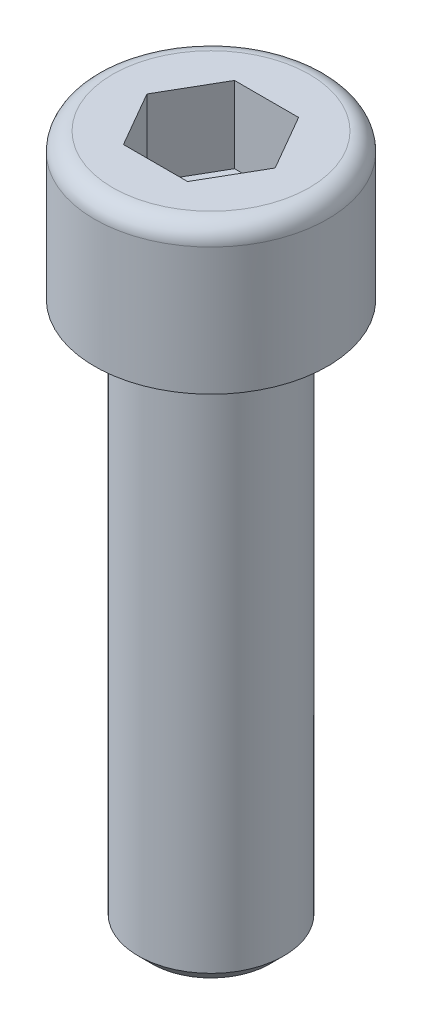
ISO-10303-21;
HEADER;
FILE_DESCRIPTION(('STEP AP214'),'2;1');
FILE_NAME('part.step','',(''),(''),'','','');
FILE_SCHEMA(('AUTOMOTIVE_DESIGN { 1 0 10303 214 1 1 1 1 }'));
ENDSEC;
DATA;
#1=APPLICATION_CONTEXT('core data for automotive mechanical design processes');
#2=APPLICATION_PROTOCOL_DEFINITION('international standard','automotive_design',2000,#1);
#3=PRODUCT_CONTEXT('',#1,'mechanical');
#4=PRODUCT('Part','Part','',(#3));
#5=PRODUCT_RELATED_PRODUCT_CATEGORY('part','',(#4));
#6=PRODUCT_DEFINITION_FORMATION('','',#4);
#7=PRODUCT_DEFINITION_CONTEXT('part definition',#1,'design');
#8=PRODUCT_DEFINITION('design','',#6,#7);
#9=PRODUCT_DEFINITION_SHAPE('','',#8);
#10=(LENGTH_UNIT() NAMED_UNIT(*) SI_UNIT(.MILLI.,.METRE.));
#11=(NAMED_UNIT(*) PLANE_ANGLE_UNIT() SI_UNIT($,.RADIAN.));
#12=(NAMED_UNIT(*) SI_UNIT($,.STERADIAN.) SOLID_ANGLE_UNIT());
#13=UNCERTAINTY_MEASURE_WITH_UNIT(LENGTH_MEASURE(1.E-05),#10,'distance_accuracy_value','');
#14=(GEOMETRIC_REPRESENTATION_CONTEXT(3) GLOBAL_UNCERTAINTY_ASSIGNED_CONTEXT((#13)) GLOBAL_UNIT_ASSIGNED_CONTEXT((#10,
#11,#12)) REPRESENTATION_CONTEXT('',''));
#15=CARTESIAN_POINT('',(0.,0.,0.));
#16=DIRECTION('',(0.,0.,1.));
#17=DIRECTION('',(1.,0.,0.));
#18=AXIS2_PLACEMENT_3D('',#15,#16,#17);
#19=CARTESIAN_POINT('',(0.,0.,0.));
#20=DIRECTION('',(0.,-1.,0.));
#21=DIRECTION('',(0.,0.,-1.));
#22=AXIS2_PLACEMENT_3D('',#19,#20,#21);
#23=PLANE('',#22);
#24=CARTESIAN_POINT('',(0.,0.,0.));
#25=DIRECTION('',(0.,-1.,0.));
#26=DIRECTION('',(0.,0.,-1.));
#27=AXIS2_PLACEMENT_3D('',#24,#25,#26);
#28=CIRCLE('',#27,6.4);
#29=CARTESIAN_POINT('',(0.,0.,-6.4));
#30=VERTEX_POINT('',#29);
#31=EDGE_CURVE('E142',#30,#30,#28,.T.);
#32=ORIENTED_EDGE('',*,*,#31,.T.);
#33=EDGE_LOOP('',(#32));
#34=FACE_BOUND('',#33,.T.);
#35=CARTESIAN_POINT('',(0.,0.,0.));
#36=DIRECTION('',(0.,-1.,0.));
#37=DIRECTION('',(0.,0.,-1.));
#38=AXIS2_PLACEMENT_3D('',#35,#36,#37);
#39=CIRCLE('',#38,4.);
#40=CARTESIAN_POINT('',(0.,0.,-4.));
#41=VERTEX_POINT('',#40);
#42=EDGE_CURVE('E134',#41,#41,#39,.T.);
#43=ORIENTED_EDGE('',*,*,#42,.F.);
#44=EDGE_LOOP('',(#43));
#45=FACE_BOUND('',#44,.T.);
#46=ADVANCED_FACE('F32',(#34,#45),#23,.T.);
#47=CARTESIAN_POINT('',(0.,8.,0.));
#48=DIRECTION('',(0.,-1.,0.));
#49=DIRECTION('',(0.,0.,-1.));
#50=AXIS2_PLACEMENT_3D('',#47,#48,#49);
#51=CYLINDRICAL_SURFACE('',#50,6.4);
#52=CARTESIAN_POINT('',(0.,7.,0.));
#53=DIRECTION('',(0.,1.,0.));
#54=DIRECTION('',(0.,0.,1.));
#55=AXIS2_PLACEMENT_3D('',#52,#53,#54);
#56=CIRCLE('',#55,6.4);
#57=CARTESIAN_POINT('',(0.,7.,6.4));
#58=VERTEX_POINT('',#57);
#59=EDGE_CURVE('E40',#58,#58,#56,.F.);
#60=ORIENTED_EDGE('',*,*,#59,.T.);
#61=EDGE_LOOP('',(#60));
#62=FACE_BOUND('',#61,.T.);
#63=ORIENTED_EDGE('',*,*,#31,.F.);
#64=EDGE_LOOP('',(#63));
#65=FACE_BOUND('',#64,.T.);
#66=ADVANCED_FACE('F153',(#62,#65),#51,.T.);
#67=CARTESIAN_POINT('',(6.4,8.,0.));
#68=DIRECTION('',(0.,1.,0.));
#69=DIRECTION('',(0.,0.,1.));
#70=AXIS2_PLACEMENT_3D('',#67,#68,#69);
#71=PLANE('',#70);
#72=CARTESIAN_POINT('',(0.,8.,0.));
#73=DIRECTION('',(0.,1.,0.));
#74=DIRECTION('',(0.,0.,1.));
#75=AXIS2_PLACEMENT_3D('',#72,#73,#74);
#76=CIRCLE('',#75,5.4);
#77=CARTESIAN_POINT('',(0.,8.,5.4));
#78=VERTEX_POINT('',#77);
#79=EDGE_CURVE('E11',#78,#78,#76,.T.);
#80=ORIENTED_EDGE('',*,*,#79,.T.);
#81=EDGE_LOOP('',(#80));
#82=FACE_BOUND('',#81,.T.);
#83=DIRECTION('',(0.5,0.,0.866025403784438));
#84=VECTOR('',#83,1.);
#85=CARTESIAN_POINT('',(-3.52183664205672,8.,0.));
#86=LINE('',#85,#84);
#87=CARTESIAN_POINT('',(-3.52183664205672,8.,0.));
#88=VERTEX_POINT('',#87);
#89=CARTESIAN_POINT('',(-1.76091832102836,8.,3.05));
#90=VERTEX_POINT('',#89);
#91=EDGE_CURVE('E47',#88,#90,#86,.T.);
#92=ORIENTED_EDGE('',*,*,#91,.F.);
#93=DIRECTION('',(-0.5,0.,0.866025403784438));
#94=VECTOR('',#93,1.);
#95=CARTESIAN_POINT('',(-1.76091832102836,8.,-3.05));
#96=LINE('',#95,#94);
#97=CARTESIAN_POINT('',(-1.76091832102836,8.,-3.05));
#98=VERTEX_POINT('',#97);
#99=EDGE_CURVE('E130',#98,#88,#96,.T.);
#100=ORIENTED_EDGE('',*,*,#99,.F.);
#101=DIRECTION('',(-1.,0.,0.));
#102=VECTOR('',#101,1.);
#103=CARTESIAN_POINT('',(1.76091832102836,8.,-3.05));
#104=LINE('',#103,#102);
#105=CARTESIAN_POINT('',(1.76091832102836,8.,-3.05));
#106=VERTEX_POINT('',#105);
#107=EDGE_CURVE('E128',#106,#98,#104,.T.);
#108=ORIENTED_EDGE('',*,*,#107,.F.);
#109=DIRECTION('',(-0.499999999999999,0.,-0.866025403784439));
#110=VECTOR('',#109,1.);
#111=CARTESIAN_POINT('',(3.52183664205671,8.,0.));
#112=LINE('',#111,#110);
#113=CARTESIAN_POINT('',(3.52183664205671,8.,0.));
#114=VERTEX_POINT('',#113);
#115=EDGE_CURVE('E95',#114,#106,#112,.T.);
#116=ORIENTED_EDGE('',*,*,#115,.F.);
#117=DIRECTION('',(0.499999999999999,0.,-0.866025403784439));
#118=VECTOR('',#117,1.);
#119=CARTESIAN_POINT('',(1.76091832102836,8.,3.05));
#120=LINE('',#119,#118);
#121=CARTESIAN_POINT('',(1.76091832102836,8.,3.05));
#122=VERTEX_POINT('',#121);
#123=EDGE_CURVE('E124',#122,#114,#120,.T.);
#124=ORIENTED_EDGE('',*,*,#123,.F.);
#125=DIRECTION('',(1.,0.,0.));
#126=VECTOR('',#125,1.);
#127=CARTESIAN_POINT('',(-1.76091832102836,8.,3.05));
#128=LINE('',#127,#126);
#129=EDGE_CURVE('E121',#90,#122,#128,.T.);
#130=ORIENTED_EDGE('',*,*,#129,.F.);
#131=EDGE_LOOP('',(#92,#100,#108,#116,#124,#130));
#132=FACE_BOUND('',#131,.T.);
#133=ADVANCED_FACE('F170',(#82,#132),#71,.T.);
#134=CARTESIAN_POINT('',(0.,-30.,0.));
#135=DIRECTION('',(0.,1.,0.));
#136=DIRECTION('',(0.,0.,1.));
#137=AXIS2_PLACEMENT_3D('',#134,#135,#136);
#138=CYLINDRICAL_SURFACE('',#137,4.);
#139=CARTESIAN_POINT('',(0.,-29.25,0.));
#140=DIRECTION('',(0.,-1.,0.));
#141=DIRECTION('',(0.,0.,-1.));
#142=AXIS2_PLACEMENT_3D('',#139,#140,#141);
#143=CIRCLE('',#142,4.);
#144=CARTESIAN_POINT('',(0.,-29.25,-4.));
#145=VERTEX_POINT('',#144);
#146=EDGE_CURVE('E148',#145,#145,#143,.F.);
#147=ORIENTED_EDGE('',*,*,#146,.T.);
#148=EDGE_LOOP('',(#147));
#149=FACE_BOUND('',#148,.T.);
#150=ORIENTED_EDGE('',*,*,#42,.T.);
#151=EDGE_LOOP('',(#150));
#152=FACE_BOUND('',#151,.T.);
#153=ADVANCED_FACE('F175',(#149,#152),#138,.T.);
#154=CARTESIAN_POINT('',(0.,-30.,0.));
#155=DIRECTION('',(0.,-1.,0.));
#156=DIRECTION('',(0.,0.,-1.));
#157=AXIS2_PLACEMENT_3D('',#154,#155,#156);
#158=PLANE('',#157);
#159=CARTESIAN_POINT('',(0.,-30.,0.));
#160=DIRECTION('',(0.,-1.,0.));
#161=DIRECTION('',(0.,0.,-1.));
#162=AXIS2_PLACEMENT_3D('',#159,#160,#161);
#163=CIRCLE('',#162,3.25000000000001);
#164=CARTESIAN_POINT('',(0.,-30.,-3.25000000000001));
#165=VERTEX_POINT('',#164);
#166=EDGE_CURVE('E145',#165,#165,#163,.T.);
#167=ORIENTED_EDGE('',*,*,#166,.T.);
#168=EDGE_LOOP('',(#167));
#169=FACE_BOUND('',#168,.T.);
#170=ADVANCED_FACE('F182',(#169),#158,.T.);
#171=CARTESIAN_POINT('',(-3.52183664205672,3.8,0.));
#172=DIRECTION('',(-0.866025403784438,0.,0.5));
#173=DIRECTION('',(0.5,0.,0.866025403784439));
#174=AXIS2_PLACEMENT_3D('',#171,#172,#173);
#175=PLANE('',#174);
#176=ORIENTED_EDGE('',*,*,#91,.T.);
#177=DIRECTION('',(0.,1.,0.));
#178=VECTOR('',#177,1.);
#179=CARTESIAN_POINT('',(-1.76091832102836,3.8,3.05));
#180=LINE('',#179,#178);
#181=CARTESIAN_POINT('',(-1.76091832102836,3.8,3.05));
#182=VERTEX_POINT('',#181);
#183=EDGE_CURVE('E77',#182,#90,#180,.T.);
#184=ORIENTED_EDGE('',*,*,#183,.F.);
#185=DIRECTION('',(0.5,0.,0.866025403784438));
#186=VECTOR('',#185,1.);
#187=CARTESIAN_POINT('',(-3.52183664205672,3.8,0.));
#188=LINE('',#187,#186);
#189=CARTESIAN_POINT('',(-3.52183664205672,3.8,0.));
#190=VERTEX_POINT('',#189);
#191=EDGE_CURVE('E132',#190,#182,#188,.T.);
#192=ORIENTED_EDGE('',*,*,#191,.F.);
#193=DIRECTION('',(0.,1.,0.));
#194=VECTOR('',#193,1.);
#195=CARTESIAN_POINT('',(-3.52183664205672,3.8,0.));
#196=LINE('',#195,#194);
#197=EDGE_CURVE('E55',#190,#88,#196,.T.);
#198=ORIENTED_EDGE('',*,*,#197,.T.);
#199=EDGE_LOOP('',(#176,#184,#192,#198));
#200=FACE_BOUND('',#199,.T.);
#201=ADVANCED_FACE('F191',(#200),#175,.F.);
#202=CARTESIAN_POINT('',(-1.76091832102836,3.8,-3.05));
#203=DIRECTION('',(-0.866025403784438,0.,-0.5));
#204=DIRECTION('',(-0.5,0.,0.866025403784438));
#205=AXIS2_PLACEMENT_3D('',#202,#203,#204);
#206=PLANE('',#205);
#207=ORIENTED_EDGE('',*,*,#99,.T.);
#208=ORIENTED_EDGE('',*,*,#197,.F.);
#209=DIRECTION('',(-0.5,0.,0.866025403784438));
#210=VECTOR('',#209,1.);
#211=CARTESIAN_POINT('',(-1.76091832102836,3.8,-3.05));
#212=LINE('',#211,#210);
#213=CARTESIAN_POINT('',(-1.76091832102836,3.8,-3.05));
#214=VERTEX_POINT('',#213);
#215=EDGE_CURVE('E107',#214,#190,#212,.T.);
#216=ORIENTED_EDGE('',*,*,#215,.F.);
#217=DIRECTION('',(0.,1.,0.));
#218=VECTOR('',#217,1.);
#219=CARTESIAN_POINT('',(-1.76091832102836,3.8,-3.05));
#220=LINE('',#219,#218);
#221=EDGE_CURVE('E99',#214,#98,#220,.T.);
#222=ORIENTED_EDGE('',*,*,#221,.T.);
#223=EDGE_LOOP('',(#207,#208,#216,#222));
#224=FACE_BOUND('',#223,.T.);
#225=ADVANCED_FACE('F193',(#224),#206,.F.);
#226=CARTESIAN_POINT('',(1.76091832102836,3.8,-3.05));
#227=DIRECTION('',(0.,0.,-1.));
#228=DIRECTION('',(-1.,0.,0.));
#229=AXIS2_PLACEMENT_3D('',#226,#227,#228);
#230=PLANE('',#229);
#231=ORIENTED_EDGE('',*,*,#107,.T.);
#232=ORIENTED_EDGE('',*,*,#221,.F.);
#233=DIRECTION('',(-1.,0.,0.));
#234=VECTOR('',#233,1.);
#235=CARTESIAN_POINT('',(1.76091832102836,3.8,-3.05));
#236=LINE('',#235,#234);
#237=CARTESIAN_POINT('',(1.76091832102836,3.8,-3.05));
#238=VERTEX_POINT('',#237);
#239=EDGE_CURVE('E103',#238,#214,#236,.T.);
#240=ORIENTED_EDGE('',*,*,#239,.F.);
#241=DIRECTION('',(0.,1.,0.));
#242=VECTOR('',#241,1.);
#243=CARTESIAN_POINT('',(1.76091832102836,3.8,-3.05));
#244=LINE('',#243,#242);
#245=EDGE_CURVE('E88',#238,#106,#244,.T.);
#246=ORIENTED_EDGE('',*,*,#245,.T.);
#247=EDGE_LOOP('',(#231,#232,#240,#246));
#248=FACE_BOUND('',#247,.T.);
#249=ADVANCED_FACE('F104',(#248),#230,.F.);
#250=CARTESIAN_POINT('',(3.52183664205671,3.8,0.));
#251=DIRECTION('',(0.866025403784439,0.,-0.499999999999999));
#252=DIRECTION('',(-0.499999999999999,0.,-0.866025403784439));
#253=AXIS2_PLACEMENT_3D('',#250,#251,#252);
#254=PLANE('',#253);
#255=ORIENTED_EDGE('',*,*,#115,.T.);
#256=ORIENTED_EDGE('',*,*,#245,.F.);
#257=DIRECTION('',(-0.499999999999999,0.,-0.866025403784439));
#258=VECTOR('',#257,1.);
#259=CARTESIAN_POINT('',(3.52183664205671,3.8,0.));
#260=LINE('',#259,#258);
#261=CARTESIAN_POINT('',(3.52183664205671,3.8,0.));
#262=VERTEX_POINT('',#261);
#263=EDGE_CURVE('E92',#262,#238,#260,.T.);
#264=ORIENTED_EDGE('',*,*,#263,.F.);
#265=DIRECTION('',(0.,1.,0.));
#266=VECTOR('',#265,1.);
#267=CARTESIAN_POINT('',(3.52183664205671,3.8,0.));
#268=LINE('',#267,#266);
#269=EDGE_CURVE('E100',#262,#114,#268,.T.);
#270=ORIENTED_EDGE('',*,*,#269,.T.);
#271=EDGE_LOOP('',(#255,#256,#264,#270));
#272=FACE_BOUND('',#271,.T.);
#273=ADVANCED_FACE('F90',(#272),#254,.F.);
#274=CARTESIAN_POINT('',(1.76091832102836,3.8,3.05));
#275=DIRECTION('',(0.866025403784439,0.,0.499999999999999));
#276=DIRECTION('',(0.499999999999999,0.,-0.866025403784439));
#277=AXIS2_PLACEMENT_3D('',#274,#275,#276);
#278=PLANE('',#277);
#279=ORIENTED_EDGE('',*,*,#123,.T.);
#280=ORIENTED_EDGE('',*,*,#269,.F.);
#281=DIRECTION('',(0.499999999999999,0.,-0.866025403784439));
#282=VECTOR('',#281,1.);
#283=CARTESIAN_POINT('',(1.76091832102836,3.8,3.05));
#284=LINE('',#283,#282);
#285=CARTESIAN_POINT('',(1.76091832102836,3.8,3.05));
#286=VERTEX_POINT('',#285);
#287=EDGE_CURVE('E113',#286,#262,#284,.T.);
#288=ORIENTED_EDGE('',*,*,#287,.F.);
#289=DIRECTION('',(0.,1.,0.));
#290=VECTOR('',#289,1.);
#291=CARTESIAN_POINT('',(1.76091832102836,3.8,3.05));
#292=LINE('',#291,#290);
#293=EDGE_CURVE('E137',#286,#122,#292,.T.);
#294=ORIENTED_EDGE('',*,*,#293,.T.);
#295=EDGE_LOOP('',(#279,#280,#288,#294));
#296=FACE_BOUND('',#295,.T.);
#297=ADVANCED_FACE('F204',(#296),#278,.F.);
#298=CARTESIAN_POINT('',(-1.76091832102836,3.8,3.05));
#299=DIRECTION('',(0.,0.,1.));
#300=DIRECTION('',(1.,0.,0.));
#301=AXIS2_PLACEMENT_3D('',#298,#299,#300);
#302=PLANE('',#301);
#303=ORIENTED_EDGE('',*,*,#129,.T.);
#304=ORIENTED_EDGE('',*,*,#293,.F.);
#305=DIRECTION('',(1.,0.,0.));
#306=VECTOR('',#305,1.);
#307=CARTESIAN_POINT('',(-1.76091832102836,3.8,3.05));
#308=LINE('',#307,#306);
#309=EDGE_CURVE('E115',#182,#286,#308,.T.);
#310=ORIENTED_EDGE('',*,*,#309,.F.);
#311=ORIENTED_EDGE('',*,*,#183,.T.);
#312=EDGE_LOOP('',(#303,#304,#310,#311));
#313=FACE_BOUND('',#312,.T.);
#314=ADVANCED_FACE('F189',(#313),#302,.F.);
#315=CARTESIAN_POINT('',(0.,3.8,0.));
#316=DIRECTION('',(0.,1.,0.));
#317=DIRECTION('',(0.,0.,1.));
#318=AXIS2_PLACEMENT_3D('',#315,#316,#317);
#319=PLANE('',#318);
#320=ORIENTED_EDGE('',*,*,#191,.T.);
#321=ORIENTED_EDGE('',*,*,#309,.T.);
#322=ORIENTED_EDGE('',*,*,#287,.T.);
#323=ORIENTED_EDGE('',*,*,#263,.T.);
#324=ORIENTED_EDGE('',*,*,#239,.T.);
#325=ORIENTED_EDGE('',*,*,#215,.T.);
#326=EDGE_LOOP('',(#320,#321,#322,#323,#324,#325));
#327=FACE_BOUND('',#326,.T.);
#328=ADVANCED_FACE('F110',(#327),#319,.T.);
#329=CARTESIAN_POINT('',(0.,-30.,0.));
#330=DIRECTION('',(0.,1.,0.));
#331=DIRECTION('',(0.,0.,1.));
#332=AXIS2_PLACEMENT_3D('',#329,#330,#331);
#333=CONICAL_SURFACE('',#332,3.25000000000001,0.785398163397448);
#334=ORIENTED_EDGE('',*,*,#146,.F.);
#335=EDGE_LOOP('',(#334));
#336=FACE_BOUND('',#335,.T.);
#337=ORIENTED_EDGE('',*,*,#166,.F.);
#338=EDGE_LOOP('',(#337));
#339=FACE_BOUND('',#338,.T.);
#340=ADVANCED_FACE('F157',(#336,#339),#333,.T.);
#341=CARTESIAN_POINT('',(0.,7.,0.));
#342=DIRECTION('',(0.,1.,0.));
#343=DIRECTION('',(0.,0.,1.));
#344=AXIS2_PLACEMENT_3D('',#341,#342,#343);
#345=TOROIDAL_SURFACE('',#344,5.4,1.);
#346=ORIENTED_EDGE('',*,*,#79,.F.);
#347=EDGE_LOOP('',(#346));
#348=FACE_BOUND('',#347,.T.);
#349=ORIENTED_EDGE('',*,*,#59,.F.);
#350=EDGE_LOOP('',(#349));
#351=FACE_BOUND('',#350,.T.);
#352=ADVANCED_FACE('F34',(#348,#351),#345,.T.);
#353=CLOSED_SHELL('',(#46,#66,#133,#153,#170,#201,#225,#249,#273,#297,#314,#328,#340,#352));
#354=MANIFOLD_SOLID_BREP('B2',#353);
#355=ADVANCED_BREP_SHAPE_REPRESENTATION('',(#18,#354),#14);
#356=SHAPE_DEFINITION_REPRESENTATION(#9,#355);
ENDSEC;
END-ISO-10303-21;
